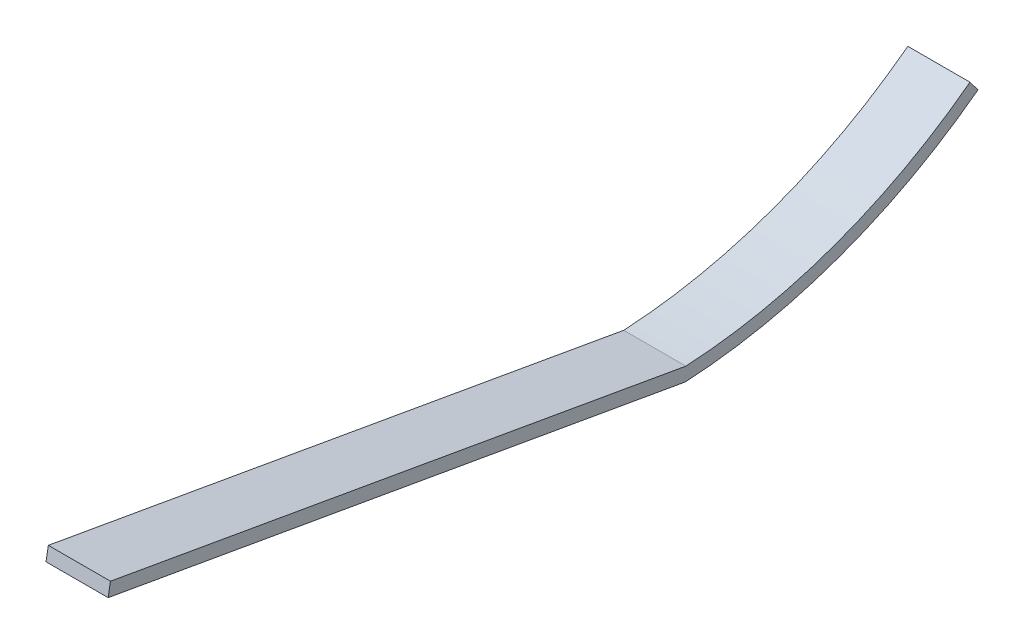
ISO-10303-21;
HEADER;
FILE_DESCRIPTION(('STEP AP214'),'2;1');
FILE_NAME('part.step','',(''),(''),'','','');
FILE_SCHEMA(('AUTOMOTIVE_DESIGN { 1 0 10303 214 1 1 1 1 }'));
ENDSEC;
DATA;
#1=APPLICATION_CONTEXT('core data for automotive mechanical design processes');
#2=APPLICATION_PROTOCOL_DEFINITION('international standard','automotive_design',2000,#1);
#3=PRODUCT_CONTEXT('',#1,'mechanical');
#4=PRODUCT('Part','Part','',(#3));
#5=PRODUCT_RELATED_PRODUCT_CATEGORY('part','',(#4));
#6=PRODUCT_DEFINITION_FORMATION('','',#4);
#7=PRODUCT_DEFINITION_CONTEXT('part definition',#1,'design');
#8=PRODUCT_DEFINITION('design','',#6,#7);
#9=PRODUCT_DEFINITION_SHAPE('','',#8);
#10=(LENGTH_UNIT() NAMED_UNIT(*) SI_UNIT(.MILLI.,.METRE.));
#11=(NAMED_UNIT(*) PLANE_ANGLE_UNIT() SI_UNIT($,.RADIAN.));
#12=(NAMED_UNIT(*) SI_UNIT($,.STERADIAN.) SOLID_ANGLE_UNIT());
#13=UNCERTAINTY_MEASURE_WITH_UNIT(LENGTH_MEASURE(1.E-05),#10,'distance_accuracy_value','');
#14=(GEOMETRIC_REPRESENTATION_CONTEXT(3) GLOBAL_UNCERTAINTY_ASSIGNED_CONTEXT((#13)) GLOBAL_UNIT_ASSIGNED_CONTEXT((#10,
#11,#12)) REPRESENTATION_CONTEXT('',''));
#15=CARTESIAN_POINT('',(0.,0.,0.));
#16=DIRECTION('',(0.,0.,1.));
#17=DIRECTION('',(1.,0.,0.));
#18=AXIS2_PLACEMENT_3D('',#15,#16,#17);
#19=CARTESIAN_POINT('',(70.,1198.37359551588,62.4557889258534));
#20=DIRECTION('',(-1.,0.,0.));
#21=DIRECTION('',(0.,0.,1.));
#22=AXIS2_PLACEMENT_3D('',#19,#20,#21);
#23=CYLINDRICAL_SURFACE('',#22,1200.);
#24=CARTESIAN_POINT('',(-70.,1198.37359551588,62.4557889258534));
#25=DIRECTION('',(1.,0.,0.));
#26=DIRECTION('',(0.,0.,-1.));
#27=AXIS2_PLACEMENT_3D('',#24,#25,#26);
#28=CIRCLE('',#27,1200.);
#29=CARTESIAN_POINT('',(-70.,0.,0.));
#30=VERTEX_POINT('',#29);
#31=CARTESIAN_POINT('',(-70.,240.220354615694,-660.));
#32=VERTEX_POINT('',#31);
#33=EDGE_CURVE('E118',#30,#32,#28,.T.);
#34=ORIENTED_EDGE('',*,*,#33,.T.);
#35=DIRECTION('',(-1.,0.,0.));
#36=VECTOR('',#35,1.);
#37=CARTESIAN_POINT('',(70.,240.220354615694,-660.));
#38=LINE('',#37,#36);
#39=CARTESIAN_POINT('',(70.,240.220354615694,-660.));
#40=VERTEX_POINT('',#39);
#41=EDGE_CURVE('E11',#40,#32,#38,.T.);
#42=ORIENTED_EDGE('',*,*,#41,.F.);
#43=CARTESIAN_POINT('',(70.,1198.37359551588,62.4557889258534));
#44=DIRECTION('',(1.,0.,0.));
#45=DIRECTION('',(0.,0.,-1.));
#46=AXIS2_PLACEMENT_3D('',#43,#44,#45);
#47=CIRCLE('',#46,1200.);
#48=CARTESIAN_POINT('',(70.,0.,0.));
#49=VERTEX_POINT('',#48);
#50=EDGE_CURVE('E83',#49,#40,#47,.T.);
#51=ORIENTED_EDGE('',*,*,#50,.F.);
#52=DIRECTION('',(-1.,0.,0.));
#53=VECTOR('',#52,1.);
#54=CARTESIAN_POINT('',(70.,0.,0.));
#55=LINE('',#54,#53);
#56=EDGE_CURVE('E114',#49,#30,#55,.T.);
#57=ORIENTED_EDGE('',*,*,#56,.T.);
#58=EDGE_LOOP('',(#34,#42,#51,#57));
#59=FACE_BOUND('',#58,.T.);
#60=ADVANCED_FACE('F37',(#59),#23,.T.);
#61=CARTESIAN_POINT('',(70.,264.174185638198,-641.938605276853));
#62=DIRECTION('',(0.,0.602046490771543,-0.798461034083487));
#63=DIRECTION('',(0.,0.798461034083487,0.602046490771543));
#64=AXIS2_PLACEMENT_3D('',#61,#62,#63);
#65=PLANE('',#64);
#66=DIRECTION('',(0.,-0.798461034083487,-0.602046490771543));
#67=VECTOR('',#66,1.);
#68=CARTESIAN_POINT('',(-70.,264.174185638198,-641.938605276853));
#69=LINE('',#68,#67);
#70=CARTESIAN_POINT('',(-70.,264.174185638198,-641.938605276853));
#71=VERTEX_POINT('',#70);
#72=EDGE_CURVE('E121',#71,#32,#69,.T.);
#73=ORIENTED_EDGE('',*,*,#72,.F.);
#74=DIRECTION('',(-1.,0.,0.));
#75=VECTOR('',#74,1.);
#76=CARTESIAN_POINT('',(70.,264.174185638198,-641.938605276853));
#77=LINE('',#76,#75);
#78=CARTESIAN_POINT('',(70.,264.174185638198,-641.938605276853));
#79=VERTEX_POINT('',#78);
#80=EDGE_CURVE('E45',#79,#71,#77,.T.);
#81=ORIENTED_EDGE('',*,*,#80,.F.);
#82=DIRECTION('',(0.,-0.798461034083487,-0.602046490771543));
#83=VECTOR('',#82,1.);
#84=CARTESIAN_POINT('',(70.,264.174185638198,-641.938605276853));
#85=LINE('',#84,#83);
#86=EDGE_CURVE('E223',#79,#40,#85,.T.);
#87=ORIENTED_EDGE('',*,*,#86,.T.);
#88=ORIENTED_EDGE('',*,*,#41,.T.);
#89=EDGE_LOOP('',(#73,#81,#87,#88));
#90=FACE_BOUND('',#89,.T.);
#91=ADVANCED_FACE('F139',(#90),#65,.T.);
#92=CARTESIAN_POINT('',(70.,1198.37359551588,62.4557889258534));
#93=DIRECTION('',(-1.,0.,0.));
#94=DIRECTION('',(0.,0.,1.));
#95=AXIS2_PLACEMENT_3D('',#92,#93,#94);
#96=CYLINDRICAL_SURFACE('',#95,1170.);
#97=CARTESIAN_POINT('',(-70.,1198.37359551588,62.4557889258534));
#98=DIRECTION('',(1.,0.,0.));
#99=DIRECTION('',(0.,0.,-1.));
#100=AXIS2_PLACEMENT_3D('',#97,#98,#99);
#101=CIRCLE('',#100,1170.);
#102=CARTESIAN_POINT('',(-70.,30.1408102250145,-1.82608543663798));
#103=VERTEX_POINT('',#102);
#104=EDGE_CURVE('E124',#103,#71,#101,.T.);
#105=ORIENTED_EDGE('',*,*,#104,.F.);
#106=DIRECTION('',(-1.,0.,0.));
#107=VECTOR('',#106,1.);
#108=CARTESIAN_POINT('',(70.,30.1408102250145,-1.82608543663798));
#109=LINE('',#108,#107);
#110=CARTESIAN_POINT('',(70.,30.1408102250145,-1.82608543663798));
#111=VERTEX_POINT('',#110);
#112=EDGE_CURVE('E104',#111,#103,#109,.T.);
#113=ORIENTED_EDGE('',*,*,#112,.F.);
#114=CARTESIAN_POINT('',(70.,1198.37359551588,62.4557889258534));
#115=DIRECTION('',(1.,0.,0.));
#116=DIRECTION('',(0.,0.,-1.));
#117=AXIS2_PLACEMENT_3D('',#114,#115,#116);
#118=CIRCLE('',#117,1170.);
#119=EDGE_CURVE('E110',#111,#79,#118,.T.);
#120=ORIENTED_EDGE('',*,*,#119,.T.);
#121=ORIENTED_EDGE('',*,*,#80,.T.);
#122=EDGE_LOOP('',(#105,#113,#120,#121));
#123=FACE_BOUND('',#122,.T.);
#124=ADVANCED_FACE('F136',(#123),#96,.F.);
#125=CARTESIAN_POINT('',(70.,29.5442325903663,-5.2094453300077));
#126=DIRECTION('',(0.,0.984807753012209,-0.173648177666923));
#127=DIRECTION('',(0.,0.173648177666923,0.984807753012209));
#128=AXIS2_PLACEMENT_3D('',#125,#126,#127);
#129=PLANE('',#128);
#130=DIRECTION('',(0.,-0.173648177666923,-0.984807753012209));
#131=VECTOR('',#130,1.);
#132=CARTESIAN_POINT('',(-70.,29.5442325903663,-5.2094453300077));
#133=LINE('',#132,#131);
#134=CARTESIAN_POINT('',(-70.,258.769307511361,1294.79055466999));
#135=VERTEX_POINT('',#134);
#136=EDGE_CURVE('E99',#135,#103,#133,.T.);
#137=ORIENTED_EDGE('',*,*,#136,.F.);
#138=DIRECTION('',(-1.,0.,0.));
#139=VECTOR('',#138,1.);
#140=CARTESIAN_POINT('',(70.,258.769307511361,1294.79055466999));
#141=LINE('',#140,#139);
#142=CARTESIAN_POINT('',(70.,258.769307511361,1294.79055466999));
#143=VERTEX_POINT('',#142);
#144=EDGE_CURVE('E94',#143,#135,#141,.T.);
#145=ORIENTED_EDGE('',*,*,#144,.F.);
#146=DIRECTION('',(0.,-0.173648177666923,-0.984807753012209));
#147=VECTOR('',#146,1.);
#148=CARTESIAN_POINT('',(70.,29.5442325903663,-5.2094453300077));
#149=LINE('',#148,#147);
#150=EDGE_CURVE('E97',#143,#111,#149,.T.);
#151=ORIENTED_EDGE('',*,*,#150,.T.);
#152=ORIENTED_EDGE('',*,*,#112,.T.);
#153=EDGE_LOOP('',(#137,#145,#151,#152));
#154=FACE_BOUND('',#153,.T.);
#155=ADVANCED_FACE('F96',(#154),#129,.T.);
#156=CARTESIAN_POINT('',(70.,229.225074920995,1300.));
#157=DIRECTION('',(0.,0.173648177666934,0.984807753012208));
#158=DIRECTION('',(0.,-0.984807753012208,0.173648177666934));
#159=AXIS2_PLACEMENT_3D('',#156,#157,#158);
#160=PLANE('',#159);
#161=DIRECTION('',(0.,0.984807753012207,-0.173648177666934));
#162=VECTOR('',#161,1.);
#163=CARTESIAN_POINT('',(-70.,229.225074920995,1300.));
#164=LINE('',#163,#162);
#165=CARTESIAN_POINT('',(-70.,229.225074920995,1300.));
#166=VERTEX_POINT('',#165);
#167=EDGE_CURVE('E128',#166,#135,#164,.T.);
#168=ORIENTED_EDGE('',*,*,#167,.F.);
#169=DIRECTION('',(-1.,0.,0.));
#170=VECTOR('',#169,1.);
#171=CARTESIAN_POINT('',(70.,229.225074920995,1300.));
#172=LINE('',#171,#170);
#173=CARTESIAN_POINT('',(70.,229.225074920995,1300.));
#174=VERTEX_POINT('',#173);
#175=EDGE_CURVE('E74',#174,#166,#172,.T.);
#176=ORIENTED_EDGE('',*,*,#175,.F.);
#177=DIRECTION('',(0.,0.984807753012207,-0.173648177666934));
#178=VECTOR('',#177,1.);
#179=CARTESIAN_POINT('',(70.,229.225074920995,1300.));
#180=LINE('',#179,#178);
#181=EDGE_CURVE('E108',#174,#143,#180,.T.);
#182=ORIENTED_EDGE('',*,*,#181,.T.);
#183=ORIENTED_EDGE('',*,*,#144,.T.);
#184=EDGE_LOOP('',(#168,#176,#182,#183));
#185=FACE_BOUND('',#184,.T.);
#186=ADVANCED_FACE('F112',(#185),#160,.T.);
#187=CARTESIAN_POINT('',(70.,0.,0.));
#188=DIRECTION('',(0.,0.984807753012209,-0.173648177666923));
#189=DIRECTION('',(0.,0.173648177666923,0.984807753012209));
#190=AXIS2_PLACEMENT_3D('',#187,#188,#189);
#191=PLANE('',#190);
#192=DIRECTION('',(0.,-0.173648177666923,-0.984807753012209));
#193=VECTOR('',#192,1.);
#194=CARTESIAN_POINT('',(-70.,0.,0.));
#195=LINE('',#194,#193);
#196=EDGE_CURVE('E77',#166,#30,#195,.T.);
#197=ORIENTED_EDGE('',*,*,#196,.T.);
#198=ORIENTED_EDGE('',*,*,#56,.F.);
#199=DIRECTION('',(0.,-0.173648177666923,-0.984807753012209));
#200=VECTOR('',#199,1.);
#201=CARTESIAN_POINT('',(70.,0.,0.));
#202=LINE('',#201,#200);
#203=EDGE_CURVE('E53',#174,#49,#202,.T.);
#204=ORIENTED_EDGE('',*,*,#203,.F.);
#205=ORIENTED_EDGE('',*,*,#175,.T.);
#206=EDGE_LOOP('',(#197,#198,#204,#205));
#207=FACE_BOUND('',#206,.T.);
#208=ADVANCED_FACE('F144',(#207),#191,.F.);
#209=CARTESIAN_POINT('',(70.,1198.37359551588,62.4557889258534));
#210=DIRECTION('',(1.,0.,0.));
#211=DIRECTION('',(0.,0.,-1.));
#212=AXIS2_PLACEMENT_3D('',#209,#210,#211);
#213=PLANE('',#212);
#214=ORIENTED_EDGE('',*,*,#50,.T.);
#215=ORIENTED_EDGE('',*,*,#86,.F.);
#216=ORIENTED_EDGE('',*,*,#119,.F.);
#217=ORIENTED_EDGE('',*,*,#150,.F.);
#218=ORIENTED_EDGE('',*,*,#181,.F.);
#219=ORIENTED_EDGE('',*,*,#203,.T.);
#220=EDGE_LOOP('',(#214,#215,#216,#217,#218,#219));
#221=FACE_BOUND('',#220,.T.);
#222=ADVANCED_FACE('F107',(#221),#213,.T.);
#223=CARTESIAN_POINT('',(-70.,1198.37359551588,62.4557889258534));
#224=DIRECTION('',(1.,0.,0.));
#225=DIRECTION('',(0.,0.,-1.));
#226=AXIS2_PLACEMENT_3D('',#223,#224,#225);
#227=PLANE('',#226);
#228=ORIENTED_EDGE('',*,*,#33,.F.);
#229=ORIENTED_EDGE('',*,*,#196,.F.);
#230=ORIENTED_EDGE('',*,*,#167,.T.);
#231=ORIENTED_EDGE('',*,*,#136,.T.);
#232=ORIENTED_EDGE('',*,*,#104,.T.);
#233=ORIENTED_EDGE('',*,*,#72,.T.);
#234=EDGE_LOOP('',(#228,#229,#230,#231,#232,#233));
#235=FACE_BOUND('',#234,.T.);
#236=ADVANCED_FACE('F142',(#235),#227,.F.);
#237=CLOSED_SHELL('',(#60,#91,#124,#155,#186,#208,#222,#236));
#238=MANIFOLD_SOLID_BREP('B2',#237);
#239=ADVANCED_BREP_SHAPE_REPRESENTATION('',(#18,#238),#14);
#240=SHAPE_DEFINITION_REPRESENTATION(#9,#239);
ENDSEC;
END-ISO-10303-21;
